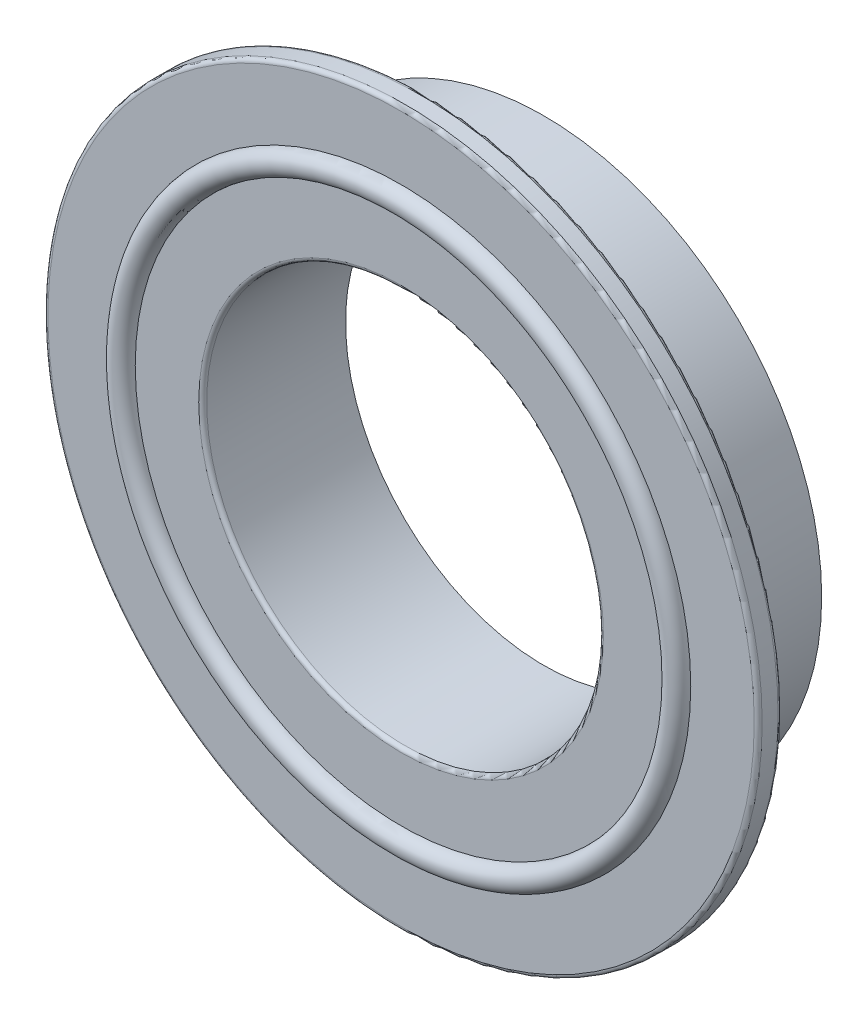
ISO-10303-21;
HEADER;
FILE_DESCRIPTION(('STEP AP214'),'2;1');
FILE_NAME('part.step','',(''),(''),'','','');
FILE_SCHEMA(('AUTOMOTIVE_DESIGN { 1 0 10303 214 1 1 1 1 }'));
ENDSEC;
DATA;
#1=APPLICATION_CONTEXT('core data for automotive mechanical design processes');
#2=APPLICATION_PROTOCOL_DEFINITION('international standard','automotive_design',2000,#1);
#3=PRODUCT_CONTEXT('',#1,'mechanical');
#4=PRODUCT('Part','Part','',(#3));
#5=PRODUCT_RELATED_PRODUCT_CATEGORY('part','',(#4));
#6=PRODUCT_DEFINITION_FORMATION('','',#4);
#7=PRODUCT_DEFINITION_CONTEXT('part definition',#1,'design');
#8=PRODUCT_DEFINITION('design','',#6,#7);
#9=PRODUCT_DEFINITION_SHAPE('','',#8);
#10=(LENGTH_UNIT() NAMED_UNIT(*) SI_UNIT(.MILLI.,.METRE.));
#11=(NAMED_UNIT(*) PLANE_ANGLE_UNIT() SI_UNIT($,.RADIAN.));
#12=(NAMED_UNIT(*) SI_UNIT($,.STERADIAN.) SOLID_ANGLE_UNIT());
#13=UNCERTAINTY_MEASURE_WITH_UNIT(LENGTH_MEASURE(1.E-05),#10,'distance_accuracy_value','');
#14=(GEOMETRIC_REPRESENTATION_CONTEXT(3) GLOBAL_UNCERTAINTY_ASSIGNED_CONTEXT((#13)) GLOBAL_UNIT_ASSIGNED_CONTEXT((#10,
#11,#12)) REPRESENTATION_CONTEXT('',''));
#15=CARTESIAN_POINT('',(0.,0.,0.));
#16=DIRECTION('',(0.,0.,1.));
#17=DIRECTION('',(1.,0.,0.));
#18=AXIS2_PLACEMENT_3D('',#15,#16,#17);
#19=CARTESIAN_POINT('',(0.,0.,3.));
#20=DIRECTION('',(0.,0.,1.));
#21=DIRECTION('',(1.,0.,0.));
#22=AXIS2_PLACEMENT_3D('',#19,#20,#21);
#23=PLANE('',#22);
#24=CARTESIAN_POINT('',(0.,0.,3.));
#25=DIRECTION('',(0.,0.,1.));
#26=DIRECTION('',(1.,0.,0.));
#27=AXIS2_PLACEMENT_3D('',#24,#25,#26);
#28=CIRCLE('',#27,44.5);
#29=CARTESIAN_POINT('',(44.5,0.,3.));
#30=VERTEX_POINT('',#29);
#31=EDGE_CURVE('E49',#30,#30,#28,.T.);
#32=ORIENTED_EDGE('',*,*,#31,.T.);
#33=EDGE_LOOP('',(#32));
#34=FACE_BOUND('',#33,.T.);
#35=CARTESIAN_POINT('',(0.,0.,3.));
#36=DIRECTION('',(0.,0.,1.));
#37=DIRECTION('',(1.,0.,0.));
#38=AXIS2_PLACEMENT_3D('',#35,#36,#37);
#39=CIRCLE('',#38,36.5);
#40=CARTESIAN_POINT('',(36.5,0.,3.));
#41=VERTEX_POINT('',#40);
#42=EDGE_CURVE('E64',#41,#41,#39,.T.);
#43=ORIENTED_EDGE('',*,*,#42,.F.);
#44=EDGE_LOOP('',(#43));
#45=FACE_BOUND('',#44,.T.);
#46=ADVANCED_FACE('F39',(#34,#45),#23,.T.);
#47=CARTESIAN_POINT('',(0.,0.,3.));
#48=DIRECTION('',(0.,0.,1.));
#49=DIRECTION('',(1.,0.,0.));
#50=AXIS2_PLACEMENT_3D('',#47,#48,#49);
#51=CIRCLE('',#50,25.5);
#52=CARTESIAN_POINT('',(25.5,0.,3.));
#53=VERTEX_POINT('',#52);
#54=EDGE_CURVE('E10',#53,#53,#51,.F.);
#55=ORIENTED_EDGE('',*,*,#54,.T.);
#56=EDGE_LOOP('',(#55));
#57=FACE_BOUND('',#56,.T.);
#58=CARTESIAN_POINT('',(0.,0.,3.));
#59=DIRECTION('',(0.,0.,-1.));
#60=DIRECTION('',(-1.,0.,0.));
#61=AXIS2_PLACEMENT_3D('',#58,#59,#60);
#62=CIRCLE('',#61,33.5);
#63=CARTESIAN_POINT('',(-33.5,0.,3.));
#64=VERTEX_POINT('',#63);
#65=EDGE_CURVE('E66',#64,#64,#62,.T.);
#66=ORIENTED_EDGE('',*,*,#65,.F.);
#67=EDGE_LOOP('',(#66));
#68=FACE_BOUND('',#67,.T.);
#69=ADVANCED_FACE('F99',(#57,#68),#23,.T.);
#70=CARTESIAN_POINT('',(0.,0.,-15.));
#71=DIRECTION('',(0.,0.,1.));
#72=DIRECTION('',(1.,0.,0.));
#73=AXIS2_PLACEMENT_3D('',#70,#71,#72);
#74=CYLINDRICAL_SURFACE('',#73,35.);
#75=CARTESIAN_POINT('',(0.,0.,-15.));
#76=DIRECTION('',(0.,0.,1.));
#77=DIRECTION('',(1.,0.,0.));
#78=AXIS2_PLACEMENT_3D('',#75,#76,#77);
#79=CIRCLE('',#78,35.);
#80=CARTESIAN_POINT('',(35.,0.,-15.));
#81=VERTEX_POINT('',#80);
#82=EDGE_CURVE('E72',#81,#81,#79,.T.);
#83=ORIENTED_EDGE('',*,*,#82,.T.);
#84=EDGE_LOOP('',(#83));
#85=FACE_BOUND('',#84,.T.);
#86=CARTESIAN_POINT('',(0.,0.,0.));
#87=DIRECTION('',(0.,0.,1.));
#88=DIRECTION('',(1.,0.,0.));
#89=AXIS2_PLACEMENT_3D('',#86,#87,#88);
#90=CIRCLE('',#89,35.);
#91=CARTESIAN_POINT('',(35.,0.,0.));
#92=VERTEX_POINT('',#91);
#93=EDGE_CURVE('E75',#92,#92,#90,.T.);
#94=ORIENTED_EDGE('',*,*,#93,.F.);
#95=EDGE_LOOP('',(#94));
#96=FACE_BOUND('',#95,.T.);
#97=ADVANCED_FACE('F96',(#85,#96),#74,.T.);
#98=CARTESIAN_POINT('',(0.,0.,-15.));
#99=DIRECTION('',(0.,0.,1.));
#100=DIRECTION('',(1.,0.,0.));
#101=AXIS2_PLACEMENT_3D('',#98,#99,#100);
#102=PLANE('',#101);
#103=CARTESIAN_POINT('',(0.,0.,-15.));
#104=DIRECTION('',(0.,0.,1.));
#105=DIRECTION('',(1.,0.,0.));
#106=AXIS2_PLACEMENT_3D('',#103,#104,#105);
#107=CIRCLE('',#106,25.);
#108=CARTESIAN_POINT('',(25.,0.,-15.));
#109=VERTEX_POINT('',#108);
#110=EDGE_CURVE('E73',#109,#109,#107,.T.);
#111=ORIENTED_EDGE('',*,*,#110,.T.);
#112=EDGE_LOOP('',(#111));
#113=FACE_BOUND('',#112,.T.);
#114=ORIENTED_EDGE('',*,*,#82,.F.);
#115=EDGE_LOOP('',(#114));
#116=FACE_BOUND('',#115,.T.);
#117=ADVANCED_FACE('F82',(#113,#116),#102,.F.);
#118=CARTESIAN_POINT('',(0.,0.,-15.));
#119=DIRECTION('',(0.,0.,1.));
#120=DIRECTION('',(1.,0.,0.));
#121=AXIS2_PLACEMENT_3D('',#118,#119,#120);
#122=CYLINDRICAL_SURFACE('',#121,25.);
#123=CARTESIAN_POINT('',(0.,0.,2.5));
#124=DIRECTION('',(0.,0.,1.));
#125=DIRECTION('',(1.,0.,0.));
#126=AXIS2_PLACEMENT_3D('',#123,#124,#125);
#127=CIRCLE('',#126,25.);
#128=CARTESIAN_POINT('',(25.,0.,2.5));
#129=VERTEX_POINT('',#128);
#130=EDGE_CURVE('E46',#129,#129,#127,.T.);
#131=ORIENTED_EDGE('',*,*,#130,.T.);
#132=EDGE_LOOP('',(#131));
#133=FACE_BOUND('',#132,.T.);
#134=ORIENTED_EDGE('',*,*,#110,.F.);
#135=EDGE_LOOP('',(#134));
#136=FACE_BOUND('',#135,.T.);
#137=ADVANCED_FACE('F81',(#133,#136),#122,.F.);
#138=CARTESIAN_POINT('',(0.,0.,0.));
#139=DIRECTION('',(0.,0.,1.));
#140=DIRECTION('',(1.,0.,0.));
#141=AXIS2_PLACEMENT_3D('',#138,#139,#140);
#142=PLANE('',#141);
#143=CARTESIAN_POINT('',(0.,0.,0.));
#144=DIRECTION('',(0.,0.,1.));
#145=DIRECTION('',(1.,0.,0.));
#146=AXIS2_PLACEMENT_3D('',#143,#144,#145);
#147=CIRCLE('',#146,44.5);
#148=CARTESIAN_POINT('',(44.5,0.,0.));
#149=VERTEX_POINT('',#148);
#150=EDGE_CURVE('E53',#149,#149,#147,.F.);
#151=ORIENTED_EDGE('',*,*,#150,.T.);
#152=EDGE_LOOP('',(#151));
#153=FACE_BOUND('',#152,.T.);
#154=ORIENTED_EDGE('',*,*,#93,.T.);
#155=EDGE_LOOP('',(#154));
#156=FACE_BOUND('',#155,.T.);
#157=ADVANCED_FACE('F88',(#153,#156),#142,.F.);
#158=CARTESIAN_POINT('',(0.,0.,3.));
#159=DIRECTION('',(0.,0.,-1.));
#160=DIRECTION('',(-1.,0.,0.));
#161=AXIS2_PLACEMENT_3D('',#158,#159,#160);
#162=CYLINDRICAL_SURFACE('',#161,45.);
#163=CARTESIAN_POINT('',(0.,0.,0.5));
#164=DIRECTION('',(0.,0.,1.));
#165=DIRECTION('',(1.,0.,0.));
#166=AXIS2_PLACEMENT_3D('',#163,#164,#165);
#167=CIRCLE('',#166,45.);
#168=CARTESIAN_POINT('',(45.,0.,0.5));
#169=VERTEX_POINT('',#168);
#170=EDGE_CURVE('E56',#169,#169,#167,.T.);
#171=ORIENTED_EDGE('',*,*,#170,.T.);
#172=EDGE_LOOP('',(#171));
#173=FACE_BOUND('',#172,.T.);
#174=CARTESIAN_POINT('',(0.,0.,2.5));
#175=DIRECTION('',(0.,0.,1.));
#176=DIRECTION('',(1.,0.,0.));
#177=AXIS2_PLACEMENT_3D('',#174,#175,#176);
#178=CIRCLE('',#177,45.);
#179=CARTESIAN_POINT('',(45.,0.,2.5));
#180=VERTEX_POINT('',#179);
#181=EDGE_CURVE('E65',#180,#180,#178,.F.);
#182=ORIENTED_EDGE('',*,*,#181,.T.);
#183=EDGE_LOOP('',(#182));
#184=FACE_BOUND('',#183,.T.);
#185=ADVANCED_FACE('F95',(#173,#184),#162,.T.);
#186=CARTESIAN_POINT('',(0.,0.,3.));
#187=DIRECTION('',(0.,0.,1.));
#188=DIRECTION('',(1.,0.,0.));
#189=AXIS2_PLACEMENT_3D('',#186,#187,#188);
#190=TOROIDAL_SURFACE('',#189,35.,1.5);
#191=ORIENTED_EDGE('',*,*,#42,.T.);
#192=EDGE_LOOP('',(#191));
#193=FACE_BOUND('',#192,.T.);
#194=ORIENTED_EDGE('',*,*,#65,.T.);
#195=EDGE_LOOP('',(#194));
#196=FACE_BOUND('',#195,.T.);
#197=ADVANCED_FACE('F107',(#193,#196),#190,.T.);
#198=CARTESIAN_POINT('',(0.,0.,0.5));
#199=DIRECTION('',(0.,0.,1.));
#200=DIRECTION('',(1.,0.,0.));
#201=AXIS2_PLACEMENT_3D('',#198,#199,#200);
#202=TOROIDAL_SURFACE('',#201,44.5,0.5);
#203=ORIENTED_EDGE('',*,*,#150,.F.);
#204=EDGE_LOOP('',(#203));
#205=FACE_BOUND('',#204,.T.);
#206=ORIENTED_EDGE('',*,*,#170,.F.);
#207=EDGE_LOOP('',(#206));
#208=FACE_BOUND('',#207,.T.);
#209=ADVANCED_FACE('F111',(#205,#208),#202,.T.);
#210=CARTESIAN_POINT('',(0.,0.,2.5));
#211=DIRECTION('',(0.,0.,1.));
#212=DIRECTION('',(1.,0.,0.));
#213=AXIS2_PLACEMENT_3D('',#210,#211,#212);
#214=TOROIDAL_SURFACE('',#213,44.5,0.5);
#215=ORIENTED_EDGE('',*,*,#181,.F.);
#216=EDGE_LOOP('',(#215));
#217=FACE_BOUND('',#216,.T.);
#218=ORIENTED_EDGE('',*,*,#31,.F.);
#219=EDGE_LOOP('',(#218));
#220=FACE_BOUND('',#219,.T.);
#221=ADVANCED_FACE('F119',(#217,#220),#214,.T.);
#222=CARTESIAN_POINT('',(0.,0.,2.5));
#223=DIRECTION('',(0.,0.,1.));
#224=DIRECTION('',(1.,0.,0.));
#225=AXIS2_PLACEMENT_3D('',#222,#223,#224);
#226=TOROIDAL_SURFACE('',#225,25.5,0.5);
#227=ORIENTED_EDGE('',*,*,#54,.F.);
#228=EDGE_LOOP('',(#227));
#229=FACE_BOUND('',#228,.T.);
#230=ORIENTED_EDGE('',*,*,#130,.F.);
#231=EDGE_LOOP('',(#230));
#232=FACE_BOUND('',#231,.T.);
#233=ADVANCED_FACE('F41',(#229,#232),#226,.T.);
#234=CLOSED_SHELL('',(#46,#69,#97,#117,#137,#157,#185,#197,#209,#221,#233));
#235=MANIFOLD_SOLID_BREP('B2',#234);
#236=ADVANCED_BREP_SHAPE_REPRESENTATION('',(#18,#235),#14);
#237=SHAPE_DEFINITION_REPRESENTATION(#9,#236);
ENDSEC;
END-ISO-10303-21;
